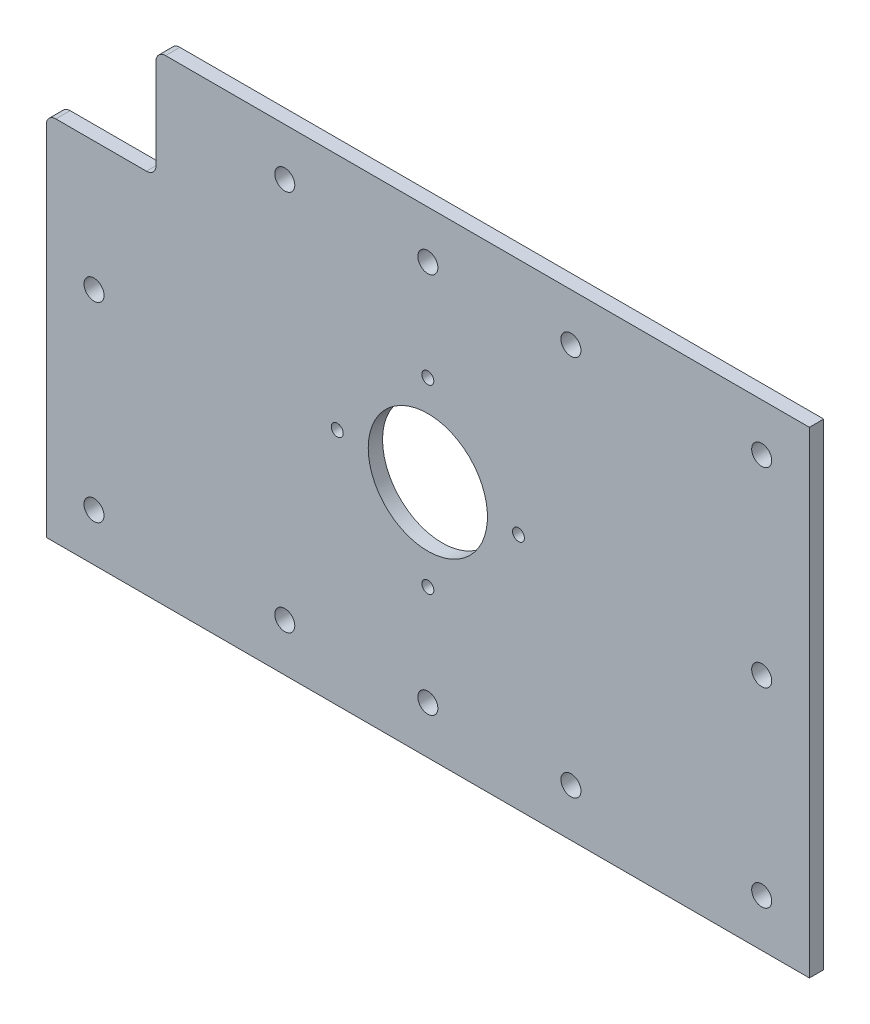
ISO-10303-21;
HEADER;
FILE_DESCRIPTION(('STEP AP214'),'2;1');
FILE_NAME('part.step','',(''),(''),'','','');
FILE_SCHEMA(('AUTOMOTIVE_DESIGN { 1 0 10303 214 1 1 1 1 }'));
ENDSEC;
DATA;
#1=APPLICATION_CONTEXT('core data for automotive mechanical design processes');
#2=APPLICATION_PROTOCOL_DEFINITION('international standard','automotive_design',2000,#1);
#3=PRODUCT_CONTEXT('',#1,'mechanical');
#4=PRODUCT('Part','Part','',(#3));
#5=PRODUCT_RELATED_PRODUCT_CATEGORY('part','',(#4));
#6=PRODUCT_DEFINITION_FORMATION('','',#4);
#7=PRODUCT_DEFINITION_CONTEXT('part definition',#1,'design');
#8=PRODUCT_DEFINITION('design','',#6,#7);
#9=PRODUCT_DEFINITION_SHAPE('','',#8);
#10=(LENGTH_UNIT() NAMED_UNIT(*) SI_UNIT(.MILLI.,.METRE.));
#11=(NAMED_UNIT(*) PLANE_ANGLE_UNIT() SI_UNIT($,.RADIAN.));
#12=(NAMED_UNIT(*) SI_UNIT($,.STERADIAN.) SOLID_ANGLE_UNIT());
#13=UNCERTAINTY_MEASURE_WITH_UNIT(LENGTH_MEASURE(1.E-05),#10,'distance_accuracy_value','');
#14=(GEOMETRIC_REPRESENTATION_CONTEXT(3) GLOBAL_UNCERTAINTY_ASSIGNED_CONTEXT((#13)) GLOBAL_UNIT_ASSIGNED_CONTEXT((#10,
#11,#12)) REPRESENTATION_CONTEXT('',''));
#15=CARTESIAN_POINT('',(0.,0.,0.));
#16=DIRECTION('',(0.,0.,1.));
#17=DIRECTION('',(1.,0.,0.));
#18=AXIS2_PLACEMENT_3D('',#15,#16,#17);
#19=CARTESIAN_POINT('',(0.,0.,3.));
#20=DIRECTION('',(0.,0.,1.));
#21=DIRECTION('',(1.,0.,0.));
#22=AXIS2_PLACEMENT_3D('',#19,#20,#21);
#23=PLANE('',#22);
#24=DIRECTION('',(-1.,0.,0.));
#25=VECTOR('',#24,1.);
#26=CARTESIAN_POINT('',(-80.,50.,3.));
#27=LINE('',#26,#25);
#28=CARTESIAN_POINT('',(80.,50.,3.));
#29=VERTEX_POINT('',#28);
#30=CARTESIAN_POINT('',(-55.,50.,3.));
#31=VERTEX_POINT('',#30);
#32=EDGE_CURVE('E114',#29,#31,#27,.T.);
#33=ORIENTED_EDGE('',*,*,#32,.T.);
#34=CARTESIAN_POINT('',(-55.,48.,3.));
#35=DIRECTION('',(0.,0.,1.));
#36=DIRECTION('',(1.,0.,0.));
#37=AXIS2_PLACEMENT_3D('',#34,#35,#36);
#38=CIRCLE('',#37,2.);
#39=CARTESIAN_POINT('',(-57.,48.,3.));
#40=VERTEX_POINT('',#39);
#41=EDGE_CURVE('E179',#31,#40,#38,.T.);
#42=ORIENTED_EDGE('',*,*,#41,.T.);
#43=DIRECTION('',(0.,1.,0.));
#44=VECTOR('',#43,1.);
#45=CARTESIAN_POINT('',(-57.,0.,3.));
#46=LINE('',#45,#44);
#47=CARTESIAN_POINT('',(-57.,29.,3.));
#48=VERTEX_POINT('',#47);
#49=EDGE_CURVE('E207',#48,#40,#46,.T.);
#50=ORIENTED_EDGE('',*,*,#49,.F.);
#51=CARTESIAN_POINT('',(-59.,29.,3.));
#52=DIRECTION('',(0.,0.,1.));
#53=DIRECTION('',(1.,0.,0.));
#54=AXIS2_PLACEMENT_3D('',#51,#52,#53);
#55=CIRCLE('',#54,2.);
#56=CARTESIAN_POINT('',(-59.,27.,3.));
#57=VERTEX_POINT('',#56);
#58=EDGE_CURVE('E48',#48,#57,#55,.F.);
#59=ORIENTED_EDGE('',*,*,#58,.T.);
#60=DIRECTION('',(1.,0.,0.));
#61=VECTOR('',#60,1.);
#62=CARTESIAN_POINT('',(0.,27.,3.));
#63=LINE('',#62,#61);
#64=CARTESIAN_POINT('',(-78.,27.,3.));
#65=VERTEX_POINT('',#64);
#66=EDGE_CURVE('E205',#65,#57,#63,.T.);
#67=ORIENTED_EDGE('',*,*,#66,.F.);
#68=CARTESIAN_POINT('',(-78.,25.,3.));
#69=DIRECTION('',(0.,0.,1.));
#70=DIRECTION('',(1.,0.,0.));
#71=AXIS2_PLACEMENT_3D('',#68,#69,#70);
#72=CIRCLE('',#71,2.);
#73=CARTESIAN_POINT('',(-80.,25.,3.));
#74=VERTEX_POINT('',#73);
#75=EDGE_CURVE('E146',#65,#74,#72,.T.);
#76=ORIENTED_EDGE('',*,*,#75,.T.);
#77=DIRECTION('',(0.,-1.,0.));
#78=VECTOR('',#77,1.);
#79=CARTESIAN_POINT('',(-80.,50.,3.));
#80=LINE('',#79,#78);
#81=CARTESIAN_POINT('',(-80.,-50.,3.));
#82=VERTEX_POINT('',#81);
#83=EDGE_CURVE('E125',#74,#82,#80,.T.);
#84=ORIENTED_EDGE('',*,*,#83,.T.);
#85=DIRECTION('',(1.,0.,0.));
#86=VECTOR('',#85,1.);
#87=CARTESIAN_POINT('',(-80.,-50.,3.));
#88=LINE('',#87,#86);
#89=CARTESIAN_POINT('',(80.,-50.,3.));
#90=VERTEX_POINT('',#89);
#91=EDGE_CURVE('E131',#82,#90,#88,.T.);
#92=ORIENTED_EDGE('',*,*,#91,.T.);
#93=DIRECTION('',(0.,1.,0.));
#94=VECTOR('',#93,1.);
#95=CARTESIAN_POINT('',(80.,50.,3.));
#96=LINE('',#95,#94);
#97=EDGE_CURVE('E126',#90,#29,#96,.T.);
#98=ORIENTED_EDGE('',*,*,#97,.T.);
#99=EDGE_LOOP('',(#33,#42,#50,#59,#67,#76,#84,#92,#98));
#100=FACE_BOUND('',#99,.T.);
#101=CARTESIAN_POINT('',(0.,0.,3.));
#102=DIRECTION('',(0.,0.,-1.));
#103=DIRECTION('',(-1.,0.,0.));
#104=AXIS2_PLACEMENT_3D('',#101,#102,#103);
#105=CIRCLE('',#104,12.5);
#106=CARTESIAN_POINT('',(-12.5,0.,3.));
#107=VERTEX_POINT('',#106);
#108=EDGE_CURVE('E175',#107,#107,#105,.T.);
#109=ORIENTED_EDGE('',*,*,#108,.T.);
#110=EDGE_LOOP('',(#109));
#111=FACE_BOUND('',#110,.T.);
#112=CARTESIAN_POINT('',(-19.,0.,3.));
#113=DIRECTION('',(0.,0.,-1.));
#114=DIRECTION('',(-1.,0.,0.));
#115=AXIS2_PLACEMENT_3D('',#112,#113,#114);
#116=CIRCLE('',#115,1.25);
#117=CARTESIAN_POINT('',(-20.25,0.,3.));
#118=VERTEX_POINT('',#117);
#119=EDGE_CURVE('E158',#118,#118,#116,.T.);
#120=ORIENTED_EDGE('',*,*,#119,.T.);
#121=EDGE_LOOP('',(#120));
#122=FACE_BOUND('',#121,.T.);
#123=CARTESIAN_POINT('',(0.,-19.,3.));
#124=DIRECTION('',(0.,0.,-1.));
#125=DIRECTION('',(-1.,0.,0.));
#126=AXIS2_PLACEMENT_3D('',#123,#124,#125);
#127=CIRCLE('',#126,1.25);
#128=CARTESIAN_POINT('',(-1.25000000000005,-19.,3.));
#129=VERTEX_POINT('',#128);
#130=EDGE_CURVE('E239',#129,#129,#127,.T.);
#131=ORIENTED_EDGE('',*,*,#130,.T.);
#132=EDGE_LOOP('',(#131));
#133=FACE_BOUND('',#132,.T.);
#134=CARTESIAN_POINT('',(18.9999999999999,0.,3.));
#135=DIRECTION('',(0.,0.,-1.));
#136=DIRECTION('',(-1.,0.,0.));
#137=AXIS2_PLACEMENT_3D('',#134,#135,#136);
#138=CIRCLE('',#137,1.25);
#139=CARTESIAN_POINT('',(17.75,0.,3.));
#140=VERTEX_POINT('',#139);
#141=EDGE_CURVE('E243',#140,#140,#138,.T.);
#142=ORIENTED_EDGE('',*,*,#141,.T.);
#143=EDGE_LOOP('',(#142));
#144=FACE_BOUND('',#143,.T.);
#145=CARTESIAN_POINT('',(0.,19.,3.));
#146=DIRECTION('',(0.,0.,-1.));
#147=DIRECTION('',(-1.,0.,0.));
#148=AXIS2_PLACEMENT_3D('',#145,#146,#147);
#149=CIRCLE('',#148,1.25);
#150=CARTESIAN_POINT('',(-1.25000000000005,19.,3.));
#151=VERTEX_POINT('',#150);
#152=EDGE_CURVE('E174',#151,#151,#149,.T.);
#153=ORIENTED_EDGE('',*,*,#152,.T.);
#154=EDGE_LOOP('',(#153));
#155=FACE_BOUND('',#154,.T.);
#156=CARTESIAN_POINT('',(70.0000000000004,0.,3.));
#157=DIRECTION('',(0.,0.,-1.));
#158=DIRECTION('',(-1.,0.,0.));
#159=AXIS2_PLACEMENT_3D('',#156,#157,#158);
#160=CIRCLE('',#159,2.09999999999999);
#161=CARTESIAN_POINT('',(67.9000000000004,0.,3.));
#162=VERTEX_POINT('',#161);
#163=EDGE_CURVE('E299',#162,#162,#160,.T.);
#164=ORIENTED_EDGE('',*,*,#163,.T.);
#165=EDGE_LOOP('',(#164));
#166=FACE_BOUND('',#165,.T.);
#167=CARTESIAN_POINT('',(70.0000000000004,-40.,3.));
#168=DIRECTION('',(0.,0.,-1.));
#169=DIRECTION('',(-1.,0.,0.));
#170=AXIS2_PLACEMENT_3D('',#167,#168,#169);
#171=CIRCLE('',#170,2.09999999999999);
#172=CARTESIAN_POINT('',(67.9000000000004,-40.,3.));
#173=VERTEX_POINT('',#172);
#174=EDGE_CURVE('E290',#173,#173,#171,.T.);
#175=ORIENTED_EDGE('',*,*,#174,.T.);
#176=EDGE_LOOP('',(#175));
#177=FACE_BOUND('',#176,.T.);
#178=CARTESIAN_POINT('',(-4.18068357710411E-13,-40.,3.));
#179=DIRECTION('',(0.,0.,-1.));
#180=DIRECTION('',(-1.,0.,0.));
#181=AXIS2_PLACEMENT_3D('',#178,#179,#180);
#182=CIRCLE('',#181,2.09999999999999);
#183=CARTESIAN_POINT('',(-2.10000000000041,-40.,3.));
#184=VERTEX_POINT('',#183);
#185=EDGE_CURVE('E314',#184,#184,#182,.T.);
#186=ORIENTED_EDGE('',*,*,#185,.T.);
#187=EDGE_LOOP('',(#186));
#188=FACE_BOUND('',#187,.T.);
#189=CARTESIAN_POINT('',(29.9999999999996,-40.,3.));
#190=DIRECTION('',(0.,0.,-1.));
#191=DIRECTION('',(-1.,0.,0.));
#192=AXIS2_PLACEMENT_3D('',#189,#190,#191);
#193=CIRCLE('',#192,2.09999999999997);
#194=CARTESIAN_POINT('',(27.8999999999996,-40.,3.));
#195=VERTEX_POINT('',#194);
#196=EDGE_CURVE('E323',#195,#195,#193,.T.);
#197=ORIENTED_EDGE('',*,*,#196,.T.);
#198=EDGE_LOOP('',(#197));
#199=FACE_BOUND('',#198,.T.);
#200=CARTESIAN_POINT('',(-30.0000000000004,-40.,3.));
#201=DIRECTION('',(0.,0.,-1.));
#202=DIRECTION('',(-1.,0.,0.));
#203=AXIS2_PLACEMENT_3D('',#200,#201,#202);
#204=CIRCLE('',#203,2.09999999999999);
#205=CARTESIAN_POINT('',(-32.1000000000004,-40.,3.));
#206=VERTEX_POINT('',#205);
#207=EDGE_CURVE('E318',#206,#206,#204,.T.);
#208=ORIENTED_EDGE('',*,*,#207,.T.);
#209=EDGE_LOOP('',(#208));
#210=FACE_BOUND('',#209,.T.);
#211=CARTESIAN_POINT('',(-4.18068357710411E-13,40.,3.));
#212=DIRECTION('',(0.,0.,1.));
#213=DIRECTION('',(1.,0.,0.));
#214=AXIS2_PLACEMENT_3D('',#211,#212,#213);
#215=CIRCLE('',#214,2.09999999999999);
#216=CARTESIAN_POINT('',(2.09999999999958,40.,3.));
#217=VERTEX_POINT('',#216);
#218=EDGE_CURVE('E266',#217,#217,#215,.T.);
#219=ORIENTED_EDGE('',*,*,#218,.F.);
#220=EDGE_LOOP('',(#219));
#221=FACE_BOUND('',#220,.T.);
#222=CARTESIAN_POINT('',(-30.0000000000004,40.,3.));
#223=DIRECTION('',(0.,0.,1.));
#224=DIRECTION('',(1.,0.,0.));
#225=AXIS2_PLACEMENT_3D('',#222,#223,#224);
#226=CIRCLE('',#225,2.09999999999999);
#227=CARTESIAN_POINT('',(-27.9000000000004,40.,3.));
#228=VERTEX_POINT('',#227);
#229=EDGE_CURVE('E275',#228,#228,#226,.T.);
#230=ORIENTED_EDGE('',*,*,#229,.F.);
#231=EDGE_LOOP('',(#230));
#232=FACE_BOUND('',#231,.T.);
#233=CARTESIAN_POINT('',(-70.0000000000004,-1.45784963472009E-12,3.));
#234=DIRECTION('',(0.,0.,1.));
#235=DIRECTION('',(1.,0.,0.));
#236=AXIS2_PLACEMENT_3D('',#233,#234,#235);
#237=CIRCLE('',#236,2.09999999999999);
#238=CARTESIAN_POINT('',(-67.9000000000004,-1.45784963472009E-12,3.));
#239=VERTEX_POINT('',#238);
#240=EDGE_CURVE('E283',#239,#239,#237,.T.);
#241=ORIENTED_EDGE('',*,*,#240,.F.);
#242=EDGE_LOOP('',(#241));
#243=FACE_BOUND('',#242,.T.);
#244=CARTESIAN_POINT('',(-69.9999999999996,-40.0000000000014,3.));
#245=DIRECTION('',(0.,0.,1.));
#246=DIRECTION('',(1.,0.,0.));
#247=AXIS2_PLACEMENT_3D('',#244,#245,#246);
#248=CIRCLE('',#247,2.09999999999999);
#249=CARTESIAN_POINT('',(-67.8999999999996,-40.0000000000014,3.));
#250=VERTEX_POINT('',#249);
#251=EDGE_CURVE('E250',#250,#250,#248,.T.);
#252=ORIENTED_EDGE('',*,*,#251,.F.);
#253=EDGE_LOOP('',(#252));
#254=FACE_BOUND('',#253,.T.);
#255=CARTESIAN_POINT('',(69.9999999999996,40.,3.));
#256=DIRECTION('',(0.,0.,1.));
#257=DIRECTION('',(1.,0.,0.));
#258=AXIS2_PLACEMENT_3D('',#255,#256,#257);
#259=CIRCLE('',#258,2.09999999999999);
#260=CARTESIAN_POINT('',(72.0999999999996,40.,3.));
#261=VERTEX_POINT('',#260);
#262=EDGE_CURVE('E259',#261,#261,#259,.T.);
#263=ORIENTED_EDGE('',*,*,#262,.F.);
#264=EDGE_LOOP('',(#263));
#265=FACE_BOUND('',#264,.T.);
#266=CARTESIAN_POINT('',(29.9999999999996,40.,3.));
#267=DIRECTION('',(0.,0.,1.));
#268=DIRECTION('',(1.,0.,0.));
#269=AXIS2_PLACEMENT_3D('',#266,#267,#268);
#270=CIRCLE('',#269,2.09999999999998);
#271=CARTESIAN_POINT('',(32.0999999999996,40.,3.));
#272=VERTEX_POINT('',#271);
#273=EDGE_CURVE('E307',#272,#272,#270,.T.);
#274=ORIENTED_EDGE('',*,*,#273,.F.);
#275=EDGE_LOOP('',(#274));
#276=FACE_BOUND('',#275,.T.);
#277=ADVANCED_FACE('F39',(#100,#111,#122,#133,#144,#155,#166,#177,#188,#199,#210,#221,#232,#243,
#254,#265,#276),#23,.T.);
#278=CARTESIAN_POINT('',(0.,0.,0.));
#279=DIRECTION('',(0.,0.,1.));
#280=DIRECTION('',(1.,0.,0.));
#281=AXIS2_PLACEMENT_3D('',#278,#279,#280);
#282=PLANE('',#281);
#283=CARTESIAN_POINT('',(0.,0.,0.));
#284=DIRECTION('',(0.,0.,1.));
#285=DIRECTION('',(1.,0.,0.));
#286=AXIS2_PLACEMENT_3D('',#283,#284,#285);
#287=CIRCLE('',#286,12.5);
#288=CARTESIAN_POINT('',(12.4999999999999,0.,0.));
#289=VERTEX_POINT('',#288);
#290=EDGE_CURVE('E171',#289,#289,#287,.T.);
#291=ORIENTED_EDGE('',*,*,#290,.T.);
#292=EDGE_LOOP('',(#291));
#293=FACE_BOUND('',#292,.T.);
#294=CARTESIAN_POINT('',(-19.,0.,0.));
#295=DIRECTION('',(0.,0.,1.));
#296=DIRECTION('',(1.,0.,0.));
#297=AXIS2_PLACEMENT_3D('',#294,#295,#296);
#298=CIRCLE('',#297,1.25);
#299=CARTESIAN_POINT('',(-17.75,0.,0.));
#300=VERTEX_POINT('',#299);
#301=EDGE_CURVE('E166',#300,#300,#298,.T.);
#302=ORIENTED_EDGE('',*,*,#301,.T.);
#303=EDGE_LOOP('',(#302));
#304=FACE_BOUND('',#303,.T.);
#305=CARTESIAN_POINT('',(0.,-19.,0.));
#306=DIRECTION('',(0.,0.,1.));
#307=DIRECTION('',(1.,0.,0.));
#308=AXIS2_PLACEMENT_3D('',#305,#306,#307);
#309=CIRCLE('',#308,1.25);
#310=CARTESIAN_POINT('',(1.24999999999996,-19.,0.));
#311=VERTEX_POINT('',#310);
#312=EDGE_CURVE('E162',#311,#311,#309,.T.);
#313=ORIENTED_EDGE('',*,*,#312,.T.);
#314=EDGE_LOOP('',(#313));
#315=FACE_BOUND('',#314,.T.);
#316=CARTESIAN_POINT('',(18.9999999999999,0.,0.));
#317=DIRECTION('',(0.,0.,1.));
#318=DIRECTION('',(1.,0.,0.));
#319=AXIS2_PLACEMENT_3D('',#316,#317,#318);
#320=CIRCLE('',#319,1.25);
#321=CARTESIAN_POINT('',(20.2499999999999,0.,0.));
#322=VERTEX_POINT('',#321);
#323=EDGE_CURVE('E157',#322,#322,#320,.T.);
#324=ORIENTED_EDGE('',*,*,#323,.T.);
#325=EDGE_LOOP('',(#324));
#326=FACE_BOUND('',#325,.T.);
#327=CARTESIAN_POINT('',(0.,19.,0.));
#328=DIRECTION('',(0.,0.,1.));
#329=DIRECTION('',(1.,0.,0.));
#330=AXIS2_PLACEMENT_3D('',#327,#328,#329);
#331=CIRCLE('',#330,1.25);
#332=CARTESIAN_POINT('',(1.24999999999995,19.,0.));
#333=VERTEX_POINT('',#332);
#334=EDGE_CURVE('E153',#333,#333,#331,.T.);
#335=ORIENTED_EDGE('',*,*,#334,.T.);
#336=EDGE_LOOP('',(#335));
#337=FACE_BOUND('',#336,.T.);
#338=CARTESIAN_POINT('',(69.9999999999996,40.,0.));
#339=DIRECTION('',(0.,0.,1.));
#340=DIRECTION('',(1.,0.,0.));
#341=AXIS2_PLACEMENT_3D('',#338,#339,#340);
#342=CIRCLE('',#341,2.09999999999999);
#343=CARTESIAN_POINT('',(72.0999999999996,40.,0.));
#344=VERTEX_POINT('',#343);
#345=EDGE_CURVE('E170',#344,#344,#342,.T.);
#346=ORIENTED_EDGE('',*,*,#345,.T.);
#347=EDGE_LOOP('',(#346));
#348=FACE_BOUND('',#347,.T.);
#349=CARTESIAN_POINT('',(-70.0000000000004,-1.45784963472009E-12,0.));
#350=DIRECTION('',(0.,0.,1.));
#351=DIRECTION('',(1.,0.,0.));
#352=AXIS2_PLACEMENT_3D('',#349,#350,#351);
#353=CIRCLE('',#352,2.09999999999999);
#354=CARTESIAN_POINT('',(-67.9000000000004,-1.45784963472009E-12,0.));
#355=VERTEX_POINT('',#354);
#356=EDGE_CURVE('E254',#355,#355,#353,.T.);
#357=ORIENTED_EDGE('',*,*,#356,.T.);
#358=EDGE_LOOP('',(#357));
#359=FACE_BOUND('',#358,.T.);
#360=CARTESIAN_POINT('',(-30.0000000000004,40.,0.));
#361=DIRECTION('',(0.,0.,1.));
#362=DIRECTION('',(1.,0.,0.));
#363=AXIS2_PLACEMENT_3D('',#360,#361,#362);
#364=CIRCLE('',#363,2.09999999999999);
#365=CARTESIAN_POINT('',(-27.9000000000004,40.,0.));
#366=VERTEX_POINT('',#365);
#367=EDGE_CURVE('E279',#366,#366,#364,.T.);
#368=ORIENTED_EDGE('',*,*,#367,.T.);
#369=EDGE_LOOP('',(#368));
#370=FACE_BOUND('',#369,.T.);
#371=DIRECTION('',(0.,1.,0.));
#372=VECTOR('',#371,1.);
#373=CARTESIAN_POINT('',(-57.,50.,0.));
#374=LINE('',#373,#372);
#375=CARTESIAN_POINT('',(-57.,29.,0.));
#376=VERTEX_POINT('',#375);
#377=CARTESIAN_POINT('',(-57.,48.,0.));
#378=VERTEX_POINT('',#377);
#379=EDGE_CURVE('E213',#376,#378,#374,.T.);
#380=ORIENTED_EDGE('',*,*,#379,.T.);
#381=CARTESIAN_POINT('',(-55.,48.,0.));
#382=DIRECTION('',(0.,0.,1.));
#383=DIRECTION('',(1.,0.,0.));
#384=AXIS2_PLACEMENT_3D('',#381,#382,#383);
#385=CIRCLE('',#384,2.);
#386=CARTESIAN_POINT('',(-55.,50.,0.));
#387=VERTEX_POINT('',#386);
#388=EDGE_CURVE('E192',#378,#387,#385,.F.);
#389=ORIENTED_EDGE('',*,*,#388,.T.);
#390=DIRECTION('',(-1.,0.,0.));
#391=VECTOR('',#390,1.);
#392=CARTESIAN_POINT('',(-80.,50.,0.));
#393=LINE('',#392,#391);
#394=CARTESIAN_POINT('',(80.,50.,0.));
#395=VERTEX_POINT('',#394);
#396=EDGE_CURVE('E343',#395,#387,#393,.T.);
#397=ORIENTED_EDGE('',*,*,#396,.F.);
#398=DIRECTION('',(0.,1.,0.));
#399=VECTOR('',#398,1.);
#400=CARTESIAN_POINT('',(80.,50.,0.));
#401=LINE('',#400,#399);
#402=CARTESIAN_POINT('',(80.,-50.,0.));
#403=VERTEX_POINT('',#402);
#404=EDGE_CURVE('E140',#403,#395,#401,.T.);
#405=ORIENTED_EDGE('',*,*,#404,.F.);
#406=DIRECTION('',(1.,0.,0.));
#407=VECTOR('',#406,1.);
#408=CARTESIAN_POINT('',(-80.,-50.,0.));
#409=LINE('',#408,#407);
#410=CARTESIAN_POINT('',(-80.,-50.,0.));
#411=VERTEX_POINT('',#410);
#412=EDGE_CURVE('E136',#411,#403,#409,.T.);
#413=ORIENTED_EDGE('',*,*,#412,.F.);
#414=DIRECTION('',(0.,-1.,0.));
#415=VECTOR('',#414,1.);
#416=CARTESIAN_POINT('',(-80.,50.,0.));
#417=LINE('',#416,#415);
#418=CARTESIAN_POINT('',(-80.,25.,0.));
#419=VERTEX_POINT('',#418);
#420=EDGE_CURVE('E346',#419,#411,#417,.T.);
#421=ORIENTED_EDGE('',*,*,#420,.F.);
#422=CARTESIAN_POINT('',(-78.,25.,0.));
#423=DIRECTION('',(0.,0.,1.));
#424=DIRECTION('',(1.,0.,0.));
#425=AXIS2_PLACEMENT_3D('',#422,#423,#424);
#426=CIRCLE('',#425,2.);
#427=CARTESIAN_POINT('',(-78.,27.,0.));
#428=VERTEX_POINT('',#427);
#429=EDGE_CURVE('E189',#419,#428,#426,.F.);
#430=ORIENTED_EDGE('',*,*,#429,.T.);
#431=DIRECTION('',(1.,0.,0.));
#432=VECTOR('',#431,1.);
#433=CARTESIAN_POINT('',(-80.,27.,0.));
#434=LINE('',#433,#432);
#435=CARTESIAN_POINT('',(-59.,27.,0.));
#436=VERTEX_POINT('',#435);
#437=EDGE_CURVE('E222',#428,#436,#434,.T.);
#438=ORIENTED_EDGE('',*,*,#437,.T.);
#439=CARTESIAN_POINT('',(-59.,29.,0.));
#440=DIRECTION('',(0.,0.,1.));
#441=DIRECTION('',(1.,0.,0.));
#442=AXIS2_PLACEMENT_3D('',#439,#440,#441);
#443=CIRCLE('',#442,2.);
#444=EDGE_CURVE('E11',#436,#376,#443,.T.);
#445=ORIENTED_EDGE('',*,*,#444,.T.);
#446=EDGE_LOOP('',(#380,#389,#397,#405,#413,#421,#430,#438,#445));
#447=FACE_BOUND('',#446,.T.);
#448=CARTESIAN_POINT('',(-30.0000000000004,-40.,0.));
#449=DIRECTION('',(0.,0.,-1.));
#450=DIRECTION('',(-1.,0.,0.));
#451=AXIS2_PLACEMENT_3D('',#448,#449,#450);
#452=CIRCLE('',#451,2.09999999999999);
#453=CARTESIAN_POINT('',(-32.1000000000004,-40.,0.));
#454=VERTEX_POINT('',#453);
#455=EDGE_CURVE('E330',#454,#454,#452,.T.);
#456=ORIENTED_EDGE('',*,*,#455,.F.);
#457=EDGE_LOOP('',(#456));
#458=FACE_BOUND('',#457,.T.);
#459=CARTESIAN_POINT('',(-4.18068357710411E-13,40.,0.));
#460=DIRECTION('',(0.,0.,1.));
#461=DIRECTION('',(1.,0.,0.));
#462=AXIS2_PLACEMENT_3D('',#459,#460,#461);
#463=CIRCLE('',#462,2.09999999999999);
#464=CARTESIAN_POINT('',(2.09999999999958,40.,0.));
#465=VERTEX_POINT('',#464);
#466=EDGE_CURVE('E271',#465,#465,#463,.T.);
#467=ORIENTED_EDGE('',*,*,#466,.T.);
#468=EDGE_LOOP('',(#467));
#469=FACE_BOUND('',#468,.T.);
#470=CARTESIAN_POINT('',(-69.9999999999996,-40.0000000000014,0.));
#471=DIRECTION('',(0.,0.,1.));
#472=DIRECTION('',(1.,0.,0.));
#473=AXIS2_PLACEMENT_3D('',#470,#471,#472);
#474=CIRCLE('',#473,2.09999999999999);
#475=CARTESIAN_POINT('',(-67.8999999999996,-40.0000000000014,0.));
#476=VERTEX_POINT('',#475);
#477=EDGE_CURVE('E255',#476,#476,#474,.T.);
#478=ORIENTED_EDGE('',*,*,#477,.T.);
#479=EDGE_LOOP('',(#478));
#480=FACE_BOUND('',#479,.T.);
#481=CARTESIAN_POINT('',(29.9999999999996,-40.,0.));
#482=DIRECTION('',(0.,0.,-1.));
#483=DIRECTION('',(-1.,0.,0.));
#484=AXIS2_PLACEMENT_3D('',#481,#482,#483);
#485=CIRCLE('',#484,2.09999999999997);
#486=CARTESIAN_POINT('',(27.8999999999996,-40.,0.));
#487=VERTEX_POINT('',#486);
#488=EDGE_CURVE('E294',#487,#487,#485,.T.);
#489=ORIENTED_EDGE('',*,*,#488,.F.);
#490=EDGE_LOOP('',(#489));
#491=FACE_BOUND('',#490,.T.);
#492=CARTESIAN_POINT('',(-4.18068357710411E-13,-40.,0.));
#493=DIRECTION('',(0.,0.,-1.));
#494=DIRECTION('',(-1.,0.,0.));
#495=AXIS2_PLACEMENT_3D('',#492,#493,#494);
#496=CIRCLE('',#495,2.09999999999999);
#497=CARTESIAN_POINT('',(-2.10000000000041,-40.,0.));
#498=VERTEX_POINT('',#497);
#499=EDGE_CURVE('E319',#498,#498,#496,.T.);
#500=ORIENTED_EDGE('',*,*,#499,.F.);
#501=EDGE_LOOP('',(#500));
#502=FACE_BOUND('',#501,.T.);
#503=CARTESIAN_POINT('',(70.0000000000004,-40.,0.));
#504=DIRECTION('',(0.,0.,-1.));
#505=DIRECTION('',(-1.,0.,0.));
#506=AXIS2_PLACEMENT_3D('',#503,#504,#505);
#507=CIRCLE('',#506,2.09999999999999);
#508=CARTESIAN_POINT('',(67.9000000000004,-40.,0.));
#509=VERTEX_POINT('',#508);
#510=EDGE_CURVE('E295',#509,#509,#507,.T.);
#511=ORIENTED_EDGE('',*,*,#510,.F.);
#512=EDGE_LOOP('',(#511));
#513=FACE_BOUND('',#512,.T.);
#514=CARTESIAN_POINT('',(70.0000000000004,0.,0.));
#515=DIRECTION('',(0.,0.,-1.));
#516=DIRECTION('',(-1.,0.,0.));
#517=AXIS2_PLACEMENT_3D('',#514,#515,#516);
#518=CIRCLE('',#517,2.09999999999999);
#519=CARTESIAN_POINT('',(67.9000000000004,0.,0.));
#520=VERTEX_POINT('',#519);
#521=EDGE_CURVE('E303',#520,#520,#518,.T.);
#522=ORIENTED_EDGE('',*,*,#521,.F.);
#523=EDGE_LOOP('',(#522));
#524=FACE_BOUND('',#523,.T.);
#525=CARTESIAN_POINT('',(29.9999999999996,40.,0.));
#526=DIRECTION('',(0.,0.,1.));
#527=DIRECTION('',(1.,0.,0.));
#528=AXIS2_PLACEMENT_3D('',#525,#526,#527);
#529=CIRCLE('',#528,2.09999999999998);
#530=CARTESIAN_POINT('',(32.0999999999996,40.,0.));
#531=VERTEX_POINT('',#530);
#532=EDGE_CURVE('E270',#531,#531,#529,.T.);
#533=ORIENTED_EDGE('',*,*,#532,.T.);
#534=EDGE_LOOP('',(#533));
#535=FACE_BOUND('',#534,.T.);
#536=ADVANCED_FACE('F219',(#293,#304,#315,#326,#337,#348,#359,#370,#447,#458,#469,#480,#491,
#502,#513,#524,#535),#282,.F.);
#537=CARTESIAN_POINT('',(80.,50.,3.));
#538=DIRECTION('',(-1.,0.,0.));
#539=DIRECTION('',(0.,0.,1.));
#540=AXIS2_PLACEMENT_3D('',#537,#538,#539);
#541=PLANE('',#540);
#542=ORIENTED_EDGE('',*,*,#404,.T.);
#543=DIRECTION('',(0.,0.,-1.));
#544=VECTOR('',#543,1.);
#545=CARTESIAN_POINT('',(80.,50.,3.));
#546=LINE('',#545,#544);
#547=EDGE_CURVE('E119',#29,#395,#546,.T.);
#548=ORIENTED_EDGE('',*,*,#547,.F.);
#549=ORIENTED_EDGE('',*,*,#97,.F.);
#550=DIRECTION('',(0.,0.,-1.));
#551=VECTOR('',#550,1.);
#552=CARTESIAN_POINT('',(80.,-50.,3.));
#553=LINE('',#552,#551);
#554=EDGE_CURVE('E149',#90,#403,#553,.T.);
#555=ORIENTED_EDGE('',*,*,#554,.T.);
#556=EDGE_LOOP('',(#542,#548,#549,#555));
#557=FACE_BOUND('',#556,.T.);
#558=ADVANCED_FACE('F138',(#557),#541,.F.);
#559=CARTESIAN_POINT('',(-80.,50.,3.));
#560=DIRECTION('',(0.,-1.,0.));
#561=DIRECTION('',(0.,0.,-1.));
#562=AXIS2_PLACEMENT_3D('',#559,#560,#561);
#563=PLANE('',#562);
#564=ORIENTED_EDGE('',*,*,#396,.T.);
#565=DIRECTION('',(0.,0.,1.));
#566=VECTOR('',#565,1.);
#567=CARTESIAN_POINT('',(-55.,50.,3.));
#568=LINE('',#567,#566);
#569=EDGE_CURVE('E122',#387,#31,#568,.T.);
#570=ORIENTED_EDGE('',*,*,#569,.T.);
#571=ORIENTED_EDGE('',*,*,#32,.F.);
#572=ORIENTED_EDGE('',*,*,#547,.T.);
#573=EDGE_LOOP('',(#564,#570,#571,#572));
#574=FACE_BOUND('',#573,.T.);
#575=ADVANCED_FACE('F117',(#574),#563,.F.);
#576=CARTESIAN_POINT('',(-80.,50.,3.));
#577=DIRECTION('',(1.,0.,0.));
#578=DIRECTION('',(0.,1.,0.));
#579=AXIS2_PLACEMENT_3D('',#576,#577,#578);
#580=PLANE('',#579);
#581=ORIENTED_EDGE('',*,*,#83,.F.);
#582=DIRECTION('',(0.,0.,1.));
#583=VECTOR('',#582,1.);
#584=CARTESIAN_POINT('',(-80.,25.,3.));
#585=LINE('',#584,#583);
#586=EDGE_CURVE('E55',#74,#419,#585,.F.);
#587=ORIENTED_EDGE('',*,*,#586,.T.);
#588=ORIENTED_EDGE('',*,*,#420,.T.);
#589=DIRECTION('',(0.,0.,-1.));
#590=VECTOR('',#589,1.);
#591=CARTESIAN_POINT('',(-80.,-50.,3.));
#592=LINE('',#591,#590);
#593=EDGE_CURVE('E142',#82,#411,#592,.T.);
#594=ORIENTED_EDGE('',*,*,#593,.F.);
#595=EDGE_LOOP('',(#581,#587,#588,#594));
#596=FACE_BOUND('',#595,.T.);
#597=ADVANCED_FACE('F379',(#596),#580,.F.);
#598=CARTESIAN_POINT('',(-80.,-50.,3.));
#599=DIRECTION('',(0.,1.,0.));
#600=DIRECTION('',(0.,0.,1.));
#601=AXIS2_PLACEMENT_3D('',#598,#599,#600);
#602=PLANE('',#601);
#603=ORIENTED_EDGE('',*,*,#412,.T.);
#604=ORIENTED_EDGE('',*,*,#554,.F.);
#605=ORIENTED_EDGE('',*,*,#91,.F.);
#606=ORIENTED_EDGE('',*,*,#593,.T.);
#607=EDGE_LOOP('',(#603,#604,#605,#606));
#608=FACE_BOUND('',#607,.T.);
#609=ADVANCED_FACE('F376',(#608),#602,.F.);
#610=CARTESIAN_POINT('',(-30.0000000000004,-40.,0.));
#611=DIRECTION('',(0.,0.,1.));
#612=DIRECTION('',(1.,0.,0.));
#613=AXIS2_PLACEMENT_3D('',#610,#611,#612);
#614=CYLINDRICAL_SURFACE('',#613,2.09999999999999);
#615=ORIENTED_EDGE('',*,*,#455,.T.);
#616=EDGE_LOOP('',(#615));
#617=FACE_BOUND('',#616,.T.);
#618=ORIENTED_EDGE('',*,*,#207,.F.);
#619=EDGE_LOOP('',(#618));
#620=FACE_BOUND('',#619,.T.);
#621=ADVANCED_FACE('F373',(#617,#620),#614,.F.);
#622=CARTESIAN_POINT('',(-4.18068357710411E-13,40.,0.));
#623=DIRECTION('',(0.,0.,1.));
#624=DIRECTION('',(1.,0.,0.));
#625=AXIS2_PLACEMENT_3D('',#622,#623,#624);
#626=CYLINDRICAL_SURFACE('',#625,2.09999999999999);
#627=ORIENTED_EDGE('',*,*,#466,.F.);
#628=EDGE_LOOP('',(#627));
#629=FACE_BOUND('',#628,.T.);
#630=ORIENTED_EDGE('',*,*,#218,.T.);
#631=EDGE_LOOP('',(#630));
#632=FACE_BOUND('',#631,.T.);
#633=ADVANCED_FACE('F407',(#629,#632),#626,.F.);
#634=CARTESIAN_POINT('',(-30.0000000000004,40.,0.));
#635=DIRECTION('',(0.,0.,1.));
#636=DIRECTION('',(1.,0.,0.));
#637=AXIS2_PLACEMENT_3D('',#634,#635,#636);
#638=CYLINDRICAL_SURFACE('',#637,2.09999999999999);
#639=ORIENTED_EDGE('',*,*,#367,.F.);
#640=EDGE_LOOP('',(#639));
#641=FACE_BOUND('',#640,.T.);
#642=ORIENTED_EDGE('',*,*,#229,.T.);
#643=EDGE_LOOP('',(#642));
#644=FACE_BOUND('',#643,.T.);
#645=ADVANCED_FACE('F414',(#641,#644),#638,.F.);
#646=CARTESIAN_POINT('',(-70.0000000000004,-1.45784963472009E-12,0.));
#647=DIRECTION('',(0.,0.,1.));
#648=DIRECTION('',(1.,0.,0.));
#649=AXIS2_PLACEMENT_3D('',#646,#647,#648);
#650=CYLINDRICAL_SURFACE('',#649,2.09999999999999);
#651=ORIENTED_EDGE('',*,*,#356,.F.);
#652=EDGE_LOOP('',(#651));
#653=FACE_BOUND('',#652,.T.);
#654=ORIENTED_EDGE('',*,*,#240,.T.);
#655=EDGE_LOOP('',(#654));
#656=FACE_BOUND('',#655,.T.);
#657=ADVANCED_FACE('F422',(#653,#656),#650,.F.);
#658=CARTESIAN_POINT('',(-69.9999999999996,-40.0000000000014,0.));
#659=DIRECTION('',(0.,0.,1.));
#660=DIRECTION('',(1.,0.,0.));
#661=AXIS2_PLACEMENT_3D('',#658,#659,#660);
#662=CYLINDRICAL_SURFACE('',#661,2.09999999999999);
#663=ORIENTED_EDGE('',*,*,#477,.F.);
#664=EDGE_LOOP('',(#663));
#665=FACE_BOUND('',#664,.T.);
#666=ORIENTED_EDGE('',*,*,#251,.T.);
#667=EDGE_LOOP('',(#666));
#668=FACE_BOUND('',#667,.T.);
#669=ADVANCED_FACE('F430',(#665,#668),#662,.F.);
#670=CARTESIAN_POINT('',(69.9999999999996,40.,0.));
#671=DIRECTION('',(0.,0.,1.));
#672=DIRECTION('',(1.,0.,0.));
#673=AXIS2_PLACEMENT_3D('',#670,#671,#672);
#674=CYLINDRICAL_SURFACE('',#673,2.09999999999999);
#675=ORIENTED_EDGE('',*,*,#345,.F.);
#676=EDGE_LOOP('',(#675));
#677=FACE_BOUND('',#676,.T.);
#678=ORIENTED_EDGE('',*,*,#262,.T.);
#679=EDGE_LOOP('',(#678));
#680=FACE_BOUND('',#679,.T.);
#681=ADVANCED_FACE('F438',(#677,#680),#674,.F.);
#682=CARTESIAN_POINT('',(29.9999999999996,-40.,0.));
#683=DIRECTION('',(0.,0.,1.));
#684=DIRECTION('',(1.,0.,0.));
#685=AXIS2_PLACEMENT_3D('',#682,#683,#684);
#686=CYLINDRICAL_SURFACE('',#685,2.09999999999997);
#687=ORIENTED_EDGE('',*,*,#488,.T.);
#688=EDGE_LOOP('',(#687));
#689=FACE_BOUND('',#688,.T.);
#690=ORIENTED_EDGE('',*,*,#196,.F.);
#691=EDGE_LOOP('',(#690));
#692=FACE_BOUND('',#691,.T.);
#693=ADVANCED_FACE('F446',(#689,#692),#686,.F.);
#694=CARTESIAN_POINT('',(-4.18068357710411E-13,-40.,0.));
#695=DIRECTION('',(0.,0.,1.));
#696=DIRECTION('',(1.,0.,0.));
#697=AXIS2_PLACEMENT_3D('',#694,#695,#696);
#698=CYLINDRICAL_SURFACE('',#697,2.09999999999999);
#699=ORIENTED_EDGE('',*,*,#499,.T.);
#700=EDGE_LOOP('',(#699));
#701=FACE_BOUND('',#700,.T.);
#702=ORIENTED_EDGE('',*,*,#185,.F.);
#703=EDGE_LOOP('',(#702));
#704=FACE_BOUND('',#703,.T.);
#705=ADVANCED_FACE('F454',(#701,#704),#698,.F.);
#706=CARTESIAN_POINT('',(70.0000000000004,-40.,0.));
#707=DIRECTION('',(0.,0.,1.));
#708=DIRECTION('',(1.,0.,0.));
#709=AXIS2_PLACEMENT_3D('',#706,#707,#708);
#710=CYLINDRICAL_SURFACE('',#709,2.09999999999999);
#711=ORIENTED_EDGE('',*,*,#510,.T.);
#712=EDGE_LOOP('',(#711));
#713=FACE_BOUND('',#712,.T.);
#714=ORIENTED_EDGE('',*,*,#174,.F.);
#715=EDGE_LOOP('',(#714));
#716=FACE_BOUND('',#715,.T.);
#717=ADVANCED_FACE('F461',(#713,#716),#710,.F.);
#718=CARTESIAN_POINT('',(70.0000000000004,0.,0.));
#719=DIRECTION('',(0.,0.,1.));
#720=DIRECTION('',(1.,0.,0.));
#721=AXIS2_PLACEMENT_3D('',#718,#719,#720);
#722=CYLINDRICAL_SURFACE('',#721,2.09999999999999);
#723=ORIENTED_EDGE('',*,*,#521,.T.);
#724=EDGE_LOOP('',(#723));
#725=FACE_BOUND('',#724,.T.);
#726=ORIENTED_EDGE('',*,*,#163,.F.);
#727=EDGE_LOOP('',(#726));
#728=FACE_BOUND('',#727,.T.);
#729=ADVANCED_FACE('F469',(#725,#728),#722,.F.);
#730=CARTESIAN_POINT('',(29.9999999999996,40.,0.));
#731=DIRECTION('',(0.,0.,1.));
#732=DIRECTION('',(1.,0.,0.));
#733=AXIS2_PLACEMENT_3D('',#730,#731,#732);
#734=CYLINDRICAL_SURFACE('',#733,2.09999999999998);
#735=ORIENTED_EDGE('',*,*,#532,.F.);
#736=EDGE_LOOP('',(#735));
#737=FACE_BOUND('',#736,.T.);
#738=ORIENTED_EDGE('',*,*,#273,.T.);
#739=EDGE_LOOP('',(#738));
#740=FACE_BOUND('',#739,.T.);
#741=ADVANCED_FACE('F477',(#737,#740),#734,.F.);
#742=CARTESIAN_POINT('',(0.,19.,3.));
#743=DIRECTION('',(0.,0.,-1.));
#744=DIRECTION('',(-1.,0.,0.));
#745=AXIS2_PLACEMENT_3D('',#742,#743,#744);
#746=CYLINDRICAL_SURFACE('',#745,1.25);
#747=ORIENTED_EDGE('',*,*,#152,.F.);
#748=EDGE_LOOP('',(#747));
#749=FACE_BOUND('',#748,.T.);
#750=ORIENTED_EDGE('',*,*,#334,.F.);
#751=EDGE_LOOP('',(#750));
#752=FACE_BOUND('',#751,.T.);
#753=ADVANCED_FACE('F485',(#749,#752),#746,.F.);
#754=CARTESIAN_POINT('',(18.9999999999999,0.,3.));
#755=DIRECTION('',(0.,0.,-1.));
#756=DIRECTION('',(-1.,0.,0.));
#757=AXIS2_PLACEMENT_3D('',#754,#755,#756);
#758=CYLINDRICAL_SURFACE('',#757,1.25);
#759=ORIENTED_EDGE('',*,*,#141,.F.);
#760=EDGE_LOOP('',(#759));
#761=FACE_BOUND('',#760,.T.);
#762=ORIENTED_EDGE('',*,*,#323,.F.);
#763=EDGE_LOOP('',(#762));
#764=FACE_BOUND('',#763,.T.);
#765=ADVANCED_FACE('F493',(#761,#764),#758,.F.);
#766=CARTESIAN_POINT('',(0.,-19.,3.));
#767=DIRECTION('',(0.,0.,-1.));
#768=DIRECTION('',(-1.,0.,0.));
#769=AXIS2_PLACEMENT_3D('',#766,#767,#768);
#770=CYLINDRICAL_SURFACE('',#769,1.25);
#771=ORIENTED_EDGE('',*,*,#130,.F.);
#772=EDGE_LOOP('',(#771));
#773=FACE_BOUND('',#772,.T.);
#774=ORIENTED_EDGE('',*,*,#312,.F.);
#775=EDGE_LOOP('',(#774));
#776=FACE_BOUND('',#775,.T.);
#777=ADVANCED_FACE('F501',(#773,#776),#770,.F.);
#778=CARTESIAN_POINT('',(-19.,0.,3.));
#779=DIRECTION('',(0.,0.,-1.));
#780=DIRECTION('',(-1.,0.,0.));
#781=AXIS2_PLACEMENT_3D('',#778,#779,#780);
#782=CYLINDRICAL_SURFACE('',#781,1.25);
#783=ORIENTED_EDGE('',*,*,#119,.F.);
#784=EDGE_LOOP('',(#783));
#785=FACE_BOUND('',#784,.T.);
#786=ORIENTED_EDGE('',*,*,#301,.F.);
#787=EDGE_LOOP('',(#786));
#788=FACE_BOUND('',#787,.T.);
#789=ADVANCED_FACE('F509',(#785,#788),#782,.F.);
#790=CARTESIAN_POINT('',(0.,0.,3.));
#791=DIRECTION('',(0.,0.,-1.));
#792=DIRECTION('',(-1.,0.,0.));
#793=AXIS2_PLACEMENT_3D('',#790,#791,#792);
#794=CYLINDRICAL_SURFACE('',#793,12.5);
#795=ORIENTED_EDGE('',*,*,#108,.F.);
#796=EDGE_LOOP('',(#795));
#797=FACE_BOUND('',#796,.T.);
#798=ORIENTED_EDGE('',*,*,#290,.F.);
#799=EDGE_LOOP('',(#798));
#800=FACE_BOUND('',#799,.T.);
#801=ADVANCED_FACE('F517',(#797,#800),#794,.F.);
#802=CARTESIAN_POINT('',(-57.,50.,0.));
#803=DIRECTION('',(1.,0.,0.));
#804=DIRECTION('',(0.,1.,0.));
#805=AXIS2_PLACEMENT_3D('',#802,#803,#804);
#806=PLANE('',#805);
#807=ORIENTED_EDGE('',*,*,#49,.T.);
#808=DIRECTION('',(0.,0.,1.));
#809=VECTOR('',#808,1.);
#810=CARTESIAN_POINT('',(-57.,48.,0.));
#811=LINE('',#810,#809);
#812=EDGE_CURVE('E186',#40,#378,#811,.F.);
#813=ORIENTED_EDGE('',*,*,#812,.T.);
#814=ORIENTED_EDGE('',*,*,#379,.F.);
#815=DIRECTION('',(0.,0.,1.));
#816=VECTOR('',#815,1.);
#817=CARTESIAN_POINT('',(-57.,29.,3.));
#818=LINE('',#817,#816);
#819=EDGE_CURVE('E182',#376,#48,#818,.T.);
#820=ORIENTED_EDGE('',*,*,#819,.T.);
#821=EDGE_LOOP('',(#807,#813,#814,#820));
#822=FACE_BOUND('',#821,.T.);
#823=ADVANCED_FACE('F224',(#822),#806,.F.);
#824=CARTESIAN_POINT('',(-80.,27.,0.));
#825=DIRECTION('',(0.,-1.,0.));
#826=DIRECTION('',(0.,0.,-1.));
#827=AXIS2_PLACEMENT_3D('',#824,#825,#826);
#828=PLANE('',#827);
#829=ORIENTED_EDGE('',*,*,#437,.F.);
#830=DIRECTION('',(0.,0.,1.));
#831=VECTOR('',#830,1.);
#832=CARTESIAN_POINT('',(-78.,27.,0.));
#833=LINE('',#832,#831);
#834=EDGE_CURVE('E197',#428,#65,#833,.T.);
#835=ORIENTED_EDGE('',*,*,#834,.T.);
#836=ORIENTED_EDGE('',*,*,#66,.T.);
#837=DIRECTION('',(0.,0.,1.));
#838=VECTOR('',#837,1.);
#839=CARTESIAN_POINT('',(-59.,27.,0.));
#840=LINE('',#839,#838);
#841=EDGE_CURVE('E63',#57,#436,#840,.F.);
#842=ORIENTED_EDGE('',*,*,#841,.T.);
#843=EDGE_LOOP('',(#829,#835,#836,#842));
#844=FACE_BOUND('',#843,.T.);
#845=ADVANCED_FACE('F210',(#844),#828,.F.);
#846=CARTESIAN_POINT('',(-55.,48.,3.));
#847=DIRECTION('',(0.,0.,1.));
#848=DIRECTION('',(1.,0.,0.));
#849=AXIS2_PLACEMENT_3D('',#846,#847,#848);
#850=CYLINDRICAL_SURFACE('',#849,2.);
#851=ORIENTED_EDGE('',*,*,#388,.F.);
#852=ORIENTED_EDGE('',*,*,#812,.F.);
#853=ORIENTED_EDGE('',*,*,#41,.F.);
#854=ORIENTED_EDGE('',*,*,#569,.F.);
#855=EDGE_LOOP('',(#851,#852,#853,#854));
#856=FACE_BOUND('',#855,.T.);
#857=ADVANCED_FACE('F354',(#856),#850,.T.);
#858=CARTESIAN_POINT('',(-78.,25.,0.));
#859=DIRECTION('',(0.,0.,1.));
#860=DIRECTION('',(1.,0.,0.));
#861=AXIS2_PLACEMENT_3D('',#858,#859,#860);
#862=CYLINDRICAL_SURFACE('',#861,2.);
#863=ORIENTED_EDGE('',*,*,#429,.F.);
#864=ORIENTED_EDGE('',*,*,#586,.F.);
#865=ORIENTED_EDGE('',*,*,#75,.F.);
#866=ORIENTED_EDGE('',*,*,#834,.F.);
#867=EDGE_LOOP('',(#863,#864,#865,#866));
#868=FACE_BOUND('',#867,.T.);
#869=ADVANCED_FACE('F356',(#868),#862,.T.);
#870=CARTESIAN_POINT('',(-59.,29.,0.));
#871=DIRECTION('',(0.,0.,-1.));
#872=DIRECTION('',(-1.,0.,0.));
#873=AXIS2_PLACEMENT_3D('',#870,#871,#872);
#874=CYLINDRICAL_SURFACE('',#873,2.);
#875=ORIENTED_EDGE('',*,*,#444,.F.);
#876=ORIENTED_EDGE('',*,*,#841,.F.);
#877=ORIENTED_EDGE('',*,*,#58,.F.);
#878=ORIENTED_EDGE('',*,*,#819,.F.);
#879=EDGE_LOOP('',(#875,#876,#877,#878));
#880=FACE_BOUND('',#879,.T.);
#881=ADVANCED_FACE('F41',(#880),#874,.F.);
#882=CLOSED_SHELL('',(#277,#536,#558,#575,#597,#609,#621,#633,#645,#657,#669,#681,#693,#705,
#717,#729,#741,#753,#765,#777,#789,#801,#823,#845,#857,#869,#881));
#883=MANIFOLD_SOLID_BREP('B2',#882);
#884=ADVANCED_BREP_SHAPE_REPRESENTATION('',(#18,#883),#14);
#885=SHAPE_DEFINITION_REPRESENTATION(#9,#884);
ENDSEC;
END-ISO-10303-21;
